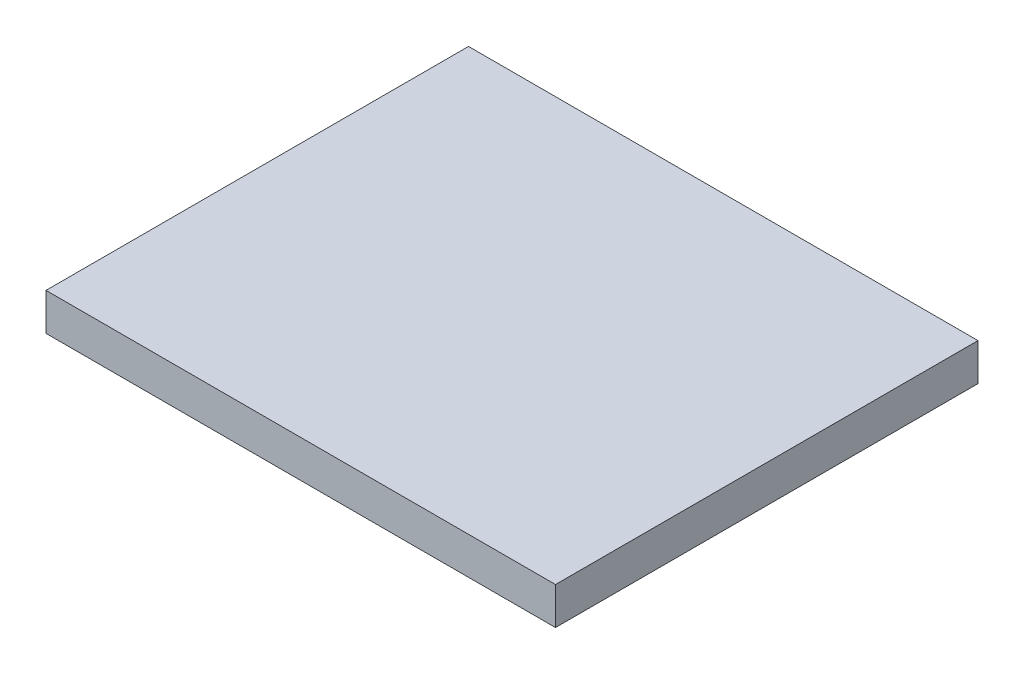
ISO-10303-21;
HEADER;
FILE_DESCRIPTION(('STEP AP214'),'2;1');
FILE_NAME('part.step','',(''),(''),'','','');
FILE_SCHEMA(('AUTOMOTIVE_DESIGN { 1 0 10303 214 1 1 1 1 }'));
ENDSEC;
DATA;
#1=APPLICATION_CONTEXT('core data for automotive mechanical design processes');
#2=APPLICATION_PROTOCOL_DEFINITION('international standard','automotive_design',2000,#1);
#3=PRODUCT_CONTEXT('',#1,'mechanical');
#4=PRODUCT('Part','Part','',(#3));
#5=PRODUCT_RELATED_PRODUCT_CATEGORY('part','',(#4));
#6=PRODUCT_DEFINITION_FORMATION('','',#4);
#7=PRODUCT_DEFINITION_CONTEXT('part definition',#1,'design');
#8=PRODUCT_DEFINITION('design','',#6,#7);
#9=PRODUCT_DEFINITION_SHAPE('','',#8);
#10=(LENGTH_UNIT() NAMED_UNIT(*) SI_UNIT(.MILLI.,.METRE.));
#11=(NAMED_UNIT(*) PLANE_ANGLE_UNIT() SI_UNIT($,.RADIAN.));
#12=(NAMED_UNIT(*) SI_UNIT($,.STERADIAN.) SOLID_ANGLE_UNIT());
#13=UNCERTAINTY_MEASURE_WITH_UNIT(LENGTH_MEASURE(1.E-05),#10,'distance_accuracy_value','');
#14=(GEOMETRIC_REPRESENTATION_CONTEXT(3) GLOBAL_UNCERTAINTY_ASSIGNED_CONTEXT((#13)) GLOBAL_UNIT_ASSIGNED_CONTEXT((#10,
#11,#12)) REPRESENTATION_CONTEXT('',''));
#15=CARTESIAN_POINT('',(0.,0.,0.));
#16=DIRECTION('',(0.,0.,1.));
#17=DIRECTION('',(1.,0.,0.));
#18=AXIS2_PLACEMENT_3D('',#15,#16,#17);
#19=CARTESIAN_POINT('',(-20.5,3.,-17.));
#20=DIRECTION('',(1.,0.,0.));
#21=DIRECTION('',(0.,0.,-1.));
#22=AXIS2_PLACEMENT_3D('',#19,#20,#21);
#23=PLANE('',#22);
#24=DIRECTION('',(0.,0.,1.));
#25=VECTOR('',#24,1.);
#26=CARTESIAN_POINT('',(-20.5,0.,-17.));
#27=LINE('',#26,#25);
#28=CARTESIAN_POINT('',(-20.5,0.,-17.));
#29=VERTEX_POINT('',#28);
#30=CARTESIAN_POINT('',(-20.5,0.,17.));
#31=VERTEX_POINT('',#30);
#32=EDGE_CURVE('E102',#29,#31,#27,.T.);
#33=ORIENTED_EDGE('',*,*,#32,.T.);
#34=DIRECTION('',(0.,-1.,0.));
#35=VECTOR('',#34,1.);
#36=CARTESIAN_POINT('',(-20.5,3.,17.));
#37=LINE('',#36,#35);
#38=CARTESIAN_POINT('',(-20.5,3.,17.));
#39=VERTEX_POINT('',#38);
#40=EDGE_CURVE('E11',#39,#31,#37,.T.);
#41=ORIENTED_EDGE('',*,*,#40,.F.);
#42=DIRECTION('',(0.,0.,1.));
#43=VECTOR('',#42,1.);
#44=CARTESIAN_POINT('',(-20.5,3.,-17.));
#45=LINE('',#44,#43);
#46=CARTESIAN_POINT('',(-20.5,3.,-17.));
#47=VERTEX_POINT('',#46);
#48=EDGE_CURVE('E90',#47,#39,#45,.T.);
#49=ORIENTED_EDGE('',*,*,#48,.F.);
#50=DIRECTION('',(0.,-1.,0.));
#51=VECTOR('',#50,1.);
#52=CARTESIAN_POINT('',(-20.5,3.,-17.));
#53=LINE('',#52,#51);
#54=EDGE_CURVE('E98',#47,#29,#53,.T.);
#55=ORIENTED_EDGE('',*,*,#54,.T.);
#56=EDGE_LOOP('',(#33,#41,#49,#55));
#57=FACE_BOUND('',#56,.T.);
#58=ADVANCED_FACE('F39',(#57),#23,.F.);
#59=CARTESIAN_POINT('',(20.5,3.,17.));
#60=DIRECTION('',(0.,0.,-1.));
#61=DIRECTION('',(-1.,0.,0.));
#62=AXIS2_PLACEMENT_3D('',#59,#60,#61);
#63=PLANE('',#62);
#64=DIRECTION('',(1.,0.,0.));
#65=VECTOR('',#64,1.);
#66=CARTESIAN_POINT('',(20.5,0.,17.));
#67=LINE('',#66,#65);
#68=CARTESIAN_POINT('',(20.5,0.,17.));
#69=VERTEX_POINT('',#68);
#70=EDGE_CURVE('E94',#31,#69,#67,.T.);
#71=ORIENTED_EDGE('',*,*,#70,.T.);
#72=DIRECTION('',(0.,-1.,0.));
#73=VECTOR('',#72,1.);
#74=CARTESIAN_POINT('',(20.5,3.,17.));
#75=LINE('',#74,#73);
#76=CARTESIAN_POINT('',(20.5,3.,17.));
#77=VERTEX_POINT('',#76);
#78=EDGE_CURVE('E47',#77,#69,#75,.T.);
#79=ORIENTED_EDGE('',*,*,#78,.F.);
#80=DIRECTION('',(1.,0.,0.));
#81=VECTOR('',#80,1.);
#82=CARTESIAN_POINT('',(20.5,3.,17.));
#83=LINE('',#82,#81);
#84=EDGE_CURVE('E85',#39,#77,#83,.T.);
#85=ORIENTED_EDGE('',*,*,#84,.F.);
#86=ORIENTED_EDGE('',*,*,#40,.T.);
#87=EDGE_LOOP('',(#71,#79,#85,#86));
#88=FACE_BOUND('',#87,.T.);
#89=ADVANCED_FACE('F93',(#88),#63,.F.);
#90=CARTESIAN_POINT('',(20.5,3.,-17.));
#91=DIRECTION('',(-1.,0.,0.));
#92=DIRECTION('',(0.,0.,1.));
#93=AXIS2_PLACEMENT_3D('',#90,#91,#92);
#94=PLANE('',#93);
#95=DIRECTION('',(0.,0.,-1.));
#96=VECTOR('',#95,1.);
#97=CARTESIAN_POINT('',(20.5,0.,-17.));
#98=LINE('',#97,#96);
#99=CARTESIAN_POINT('',(20.5,0.,-17.));
#100=VERTEX_POINT('',#99);
#101=EDGE_CURVE('E72',#69,#100,#98,.T.);
#102=ORIENTED_EDGE('',*,*,#101,.T.);
#103=DIRECTION('',(0.,-1.,0.));
#104=VECTOR('',#103,1.);
#105=CARTESIAN_POINT('',(20.5,3.,-17.));
#106=LINE('',#105,#104);
#107=CARTESIAN_POINT('',(20.5,3.,-17.));
#108=VERTEX_POINT('',#107);
#109=EDGE_CURVE('E95',#108,#100,#106,.T.);
#110=ORIENTED_EDGE('',*,*,#109,.F.);
#111=DIRECTION('',(0.,0.,-1.));
#112=VECTOR('',#111,1.);
#113=CARTESIAN_POINT('',(20.5,3.,-17.));
#114=LINE('',#113,#112);
#115=EDGE_CURVE('E88',#77,#108,#114,.T.);
#116=ORIENTED_EDGE('',*,*,#115,.F.);
#117=ORIENTED_EDGE('',*,*,#78,.T.);
#118=EDGE_LOOP('',(#102,#110,#116,#117));
#119=FACE_BOUND('',#118,.T.);
#120=ADVANCED_FACE('F96',(#119),#94,.F.);
#121=CARTESIAN_POINT('',(20.5,3.,-17.));
#122=DIRECTION('',(0.,0.,1.));
#123=DIRECTION('',(1.,0.,0.));
#124=AXIS2_PLACEMENT_3D('',#121,#122,#123);
#125=PLANE('',#124);
#126=DIRECTION('',(-1.,0.,0.));
#127=VECTOR('',#126,1.);
#128=CARTESIAN_POINT('',(20.5,0.,-17.));
#129=LINE('',#128,#127);
#130=EDGE_CURVE('E78',#100,#29,#129,.T.);
#131=ORIENTED_EDGE('',*,*,#130,.T.);
#132=ORIENTED_EDGE('',*,*,#54,.F.);
#133=DIRECTION('',(-1.,0.,0.));
#134=VECTOR('',#133,1.);
#135=CARTESIAN_POINT('',(20.5,3.,-17.));
#136=LINE('',#135,#134);
#137=EDGE_CURVE('E55',#108,#47,#136,.T.);
#138=ORIENTED_EDGE('',*,*,#137,.F.);
#139=ORIENTED_EDGE('',*,*,#109,.T.);
#140=EDGE_LOOP('',(#131,#132,#138,#139));
#141=FACE_BOUND('',#140,.T.);
#142=ADVANCED_FACE('F109',(#141),#125,.F.);
#143=CARTESIAN_POINT('',(0.,3.,0.));
#144=DIRECTION('',(0.,-1.,0.));
#145=DIRECTION('',(0.,0.,-1.));
#146=AXIS2_PLACEMENT_3D('',#143,#144,#145);
#147=PLANE('',#146);
#148=ORIENTED_EDGE('',*,*,#48,.T.);
#149=ORIENTED_EDGE('',*,*,#84,.T.);
#150=ORIENTED_EDGE('',*,*,#115,.T.);
#151=ORIENTED_EDGE('',*,*,#137,.T.);
#152=EDGE_LOOP('',(#148,#149,#150,#151));
#153=FACE_BOUND('',#152,.T.);
#154=ADVANCED_FACE('F86',(#153),#147,.F.);
#155=CARTESIAN_POINT('',(0.,0.,0.));
#156=DIRECTION('',(0.,-1.,0.));
#157=DIRECTION('',(0.,0.,-1.));
#158=AXIS2_PLACEMENT_3D('',#155,#156,#157);
#159=PLANE('',#158);
#160=ORIENTED_EDGE('',*,*,#32,.F.);
#161=ORIENTED_EDGE('',*,*,#130,.F.);
#162=ORIENTED_EDGE('',*,*,#101,.F.);
#163=ORIENTED_EDGE('',*,*,#70,.F.);
#164=EDGE_LOOP('',(#160,#161,#162,#163));
#165=FACE_BOUND('',#164,.T.);
#166=ADVANCED_FACE('F112',(#165),#159,.T.);
#167=CLOSED_SHELL('',(#58,#89,#120,#142,#154,#166));
#168=MANIFOLD_SOLID_BREP('B2',#167);
#169=ADVANCED_BREP_SHAPE_REPRESENTATION('',(#18,#168),#14);
#170=SHAPE_DEFINITION_REPRESENTATION(#9,#169);
ENDSEC;
END-ISO-10303-21;
